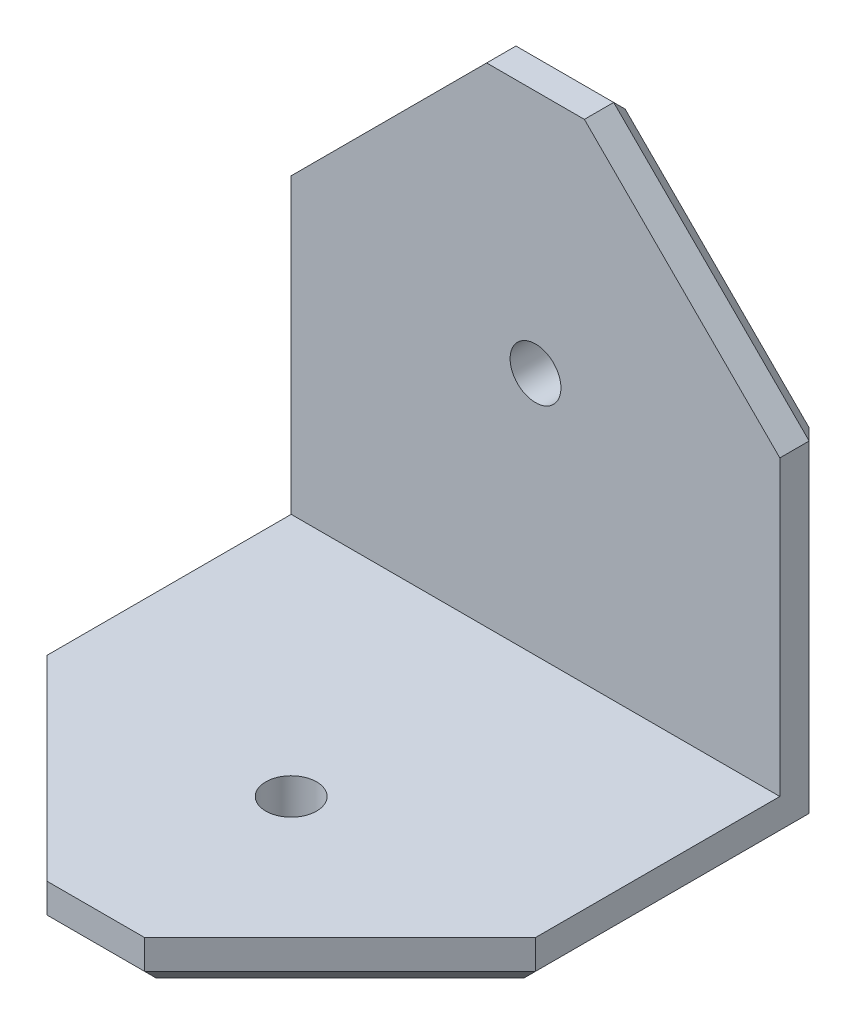
ISO-10303-21;
HEADER;
FILE_DESCRIPTION(('STEP AP214'),'2;1');
FILE_NAME('part.step','',(''),(''),'','','');
FILE_SCHEMA(('AUTOMOTIVE_DESIGN { 1 0 10303 214 1 1 1 1 }'));
ENDSEC;
DATA;
#1=APPLICATION_CONTEXT('core data for automotive mechanical design processes');
#2=APPLICATION_PROTOCOL_DEFINITION('international standard','automotive_design',2000,#1);
#3=PRODUCT_CONTEXT('',#1,'mechanical');
#4=PRODUCT('Part','Part','',(#3));
#5=PRODUCT_RELATED_PRODUCT_CATEGORY('part','',(#4));
#6=PRODUCT_DEFINITION_FORMATION('','',#4);
#7=PRODUCT_DEFINITION_CONTEXT('part definition',#1,'design');
#8=PRODUCT_DEFINITION('design','',#6,#7);
#9=PRODUCT_DEFINITION_SHAPE('','',#8);
#10=(LENGTH_UNIT() NAMED_UNIT(*) SI_UNIT(.MILLI.,.METRE.));
#11=(NAMED_UNIT(*) PLANE_ANGLE_UNIT() SI_UNIT($,.RADIAN.));
#12=(NAMED_UNIT(*) SI_UNIT($,.STERADIAN.) SOLID_ANGLE_UNIT());
#13=UNCERTAINTY_MEASURE_WITH_UNIT(LENGTH_MEASURE(1.E-05),#10,'distance_accuracy_value','');
#14=(GEOMETRIC_REPRESENTATION_CONTEXT(3) GLOBAL_UNCERTAINTY_ASSIGNED_CONTEXT((#13)) GLOBAL_UNIT_ASSIGNED_CONTEXT((#10,
#11,#12)) REPRESENTATION_CONTEXT('',''));
#15=CARTESIAN_POINT('',(0.,0.,0.));
#16=DIRECTION('',(0.,0.,1.));
#17=DIRECTION('',(1.,0.,0.));
#18=AXIS2_PLACEMENT_3D('',#15,#16,#17);
#19=CARTESIAN_POINT('',(25.,5.,-25.));
#20=DIRECTION('',(-1.,0.,0.));
#21=DIRECTION('',(0.,0.,1.));
#22=AXIS2_PLACEMENT_3D('',#19,#20,#21);
#23=PLANE('',#22);
#24=DIRECTION('',(0.,-1.,0.));
#25=VECTOR('',#24,1.);
#26=CARTESIAN_POINT('',(25.,5.,4.99999999999999));
#27=LINE('',#26,#25);
#28=CARTESIAN_POINT('',(25.,5.,4.99999999999999));
#29=VERTEX_POINT('',#28);
#30=CARTESIAN_POINT('',(25.,2.00000000000001,4.99999999999999));
#31=VERTEX_POINT('',#30);
#32=EDGE_CURVE('E211',#29,#31,#27,.T.);
#33=ORIENTED_EDGE('',*,*,#32,.T.);
#34=DIRECTION('',(0.,0.,-1.));
#35=VECTOR('',#34,1.);
#36=CARTESIAN_POINT('',(25.,2.00000000000002,-25.));
#37=LINE('',#36,#35);
#38=CARTESIAN_POINT('',(25.,2.00000000000002,-23.));
#39=VERTEX_POINT('',#38);
#40=EDGE_CURVE('E235',#31,#39,#37,.T.);
#41=ORIENTED_EDGE('',*,*,#40,.T.);
#42=DIRECTION('',(0.,1.,0.));
#43=VECTOR('',#42,1.);
#44=CARTESIAN_POINT('',(25.,5.,-23.));
#45=LINE('',#44,#43);
#46=CARTESIAN_POINT('',(25.,34.9999999999999,-23.));
#47=VERTEX_POINT('',#46);
#48=EDGE_CURVE('E233',#39,#47,#45,.T.);
#49=ORIENTED_EDGE('',*,*,#48,.T.);
#50=DIRECTION('',(0.,0.,1.));
#51=VECTOR('',#50,1.);
#52=CARTESIAN_POINT('',(25.,34.9999999999999,-25.));
#53=LINE('',#52,#51);
#54=CARTESIAN_POINT('',(25.,34.9999999999999,-20.));
#55=VERTEX_POINT('',#54);
#56=EDGE_CURVE('E180',#47,#55,#53,.T.);
#57=ORIENTED_EDGE('',*,*,#56,.T.);
#58=DIRECTION('',(0.,-1.,0.));
#59=VECTOR('',#58,1.);
#60=CARTESIAN_POINT('',(25.,55.,-20.));
#61=LINE('',#60,#59);
#62=CARTESIAN_POINT('',(25.,5.,-20.));
#63=VERTEX_POINT('',#62);
#64=EDGE_CURVE('E179',#55,#63,#61,.T.);
#65=ORIENTED_EDGE('',*,*,#64,.T.);
#66=DIRECTION('',(0.,0.,-1.));
#67=VECTOR('',#66,1.);
#68=CARTESIAN_POINT('',(25.,5.,-25.));
#69=LINE('',#68,#67);
#70=EDGE_CURVE('E162',#29,#63,#69,.T.);
#71=ORIENTED_EDGE('',*,*,#70,.F.);
#72=EDGE_LOOP('',(#33,#41,#49,#57,#65,#71));
#73=FACE_BOUND('',#72,.T.);
#74=ADVANCED_FACE('F40',(#73),#23,.F.);
#75=CARTESIAN_POINT('',(-25.,5.,-25.));
#76=DIRECTION('',(0.,0.,1.));
#77=DIRECTION('',(1.,0.,0.));
#78=AXIS2_PLACEMENT_3D('',#75,#76,#77);
#79=PLANE('',#78);
#80=CARTESIAN_POINT('',(0.,30.,-25.));
#81=DIRECTION('',(0.,0.,1.));
#82=DIRECTION('',(1.,0.,0.));
#83=AXIS2_PLACEMENT_3D('',#80,#81,#82);
#84=CIRCLE('',#83,2.6);
#85=CARTESIAN_POINT('',(2.6,30.,-25.));
#86=VERTEX_POINT('',#85);
#87=EDGE_CURVE('E187',#86,#86,#84,.T.);
#88=ORIENTED_EDGE('',*,*,#87,.T.);
#89=EDGE_LOOP('',(#88));
#90=FACE_BOUND('',#89,.T.);
#91=DIRECTION('',(0.707106781186546,-0.707106781186549,0.));
#92=VECTOR('',#91,1.);
#93=CARTESIAN_POINT('',(23.5857864376269,33.5857864376268,-25.));
#94=LINE('',#93,#92);
#95=CARTESIAN_POINT('',(4.17157287525378,53.,-25.));
#96=VERTEX_POINT('',#95);
#97=CARTESIAN_POINT('',(23.,34.1715728752537,-25.));
#98=VERTEX_POINT('',#97);
#99=EDGE_CURVE('E273',#96,#98,#94,.T.);
#100=ORIENTED_EDGE('',*,*,#99,.T.);
#101=DIRECTION('',(0.,-1.,0.));
#102=VECTOR('',#101,1.);
#103=CARTESIAN_POINT('',(23.,5.,-25.));
#104=LINE('',#103,#102);
#105=CARTESIAN_POINT('',(23.,2.00000000000002,-25.));
#106=VERTEX_POINT('',#105);
#107=EDGE_CURVE('E275',#98,#106,#104,.T.);
#108=ORIENTED_EDGE('',*,*,#107,.T.);
#109=DIRECTION('',(-1.,0.,0.));
#110=VECTOR('',#109,1.);
#111=CARTESIAN_POINT('',(-25.,2.00000000000002,-25.));
#112=LINE('',#111,#110);
#113=CARTESIAN_POINT('',(-23.,2.00000000000002,-25.));
#114=VERTEX_POINT('',#113);
#115=EDGE_CURVE('E227',#106,#114,#112,.T.);
#116=ORIENTED_EDGE('',*,*,#115,.T.);
#117=DIRECTION('',(0.,1.,0.));
#118=VECTOR('',#117,1.);
#119=CARTESIAN_POINT('',(-23.,5.,-25.));
#120=LINE('',#119,#118);
#121=CARTESIAN_POINT('',(-23.,34.1715728752537,-25.));
#122=VERTEX_POINT('',#121);
#123=EDGE_CURVE('E267',#114,#122,#120,.T.);
#124=ORIENTED_EDGE('',*,*,#123,.T.);
#125=DIRECTION('',(0.707106781186546,0.707106781186549,0.));
#126=VECTOR('',#125,1.);
#127=CARTESIAN_POINT('',(-3.58578643762688,53.5857864376269,-25.));
#128=LINE('',#127,#126);
#129=CARTESIAN_POINT('',(-4.17157287525379,53.,-25.));
#130=VERTEX_POINT('',#129);
#131=EDGE_CURVE('E269',#122,#130,#128,.T.);
#132=ORIENTED_EDGE('',*,*,#131,.T.);
#133=DIRECTION('',(1.,0.,0.));
#134=VECTOR('',#133,1.);
#135=CARTESIAN_POINT('',(-25.,53.,-25.));
#136=LINE('',#135,#134);
#137=EDGE_CURVE('E271',#130,#96,#136,.T.);
#138=ORIENTED_EDGE('',*,*,#137,.T.);
#139=EDGE_LOOP('',(#100,#108,#116,#124,#132,#138));
#140=FACE_BOUND('',#139,.T.);
#141=ADVANCED_FACE('F335',(#90,#140),#79,.F.);
#142=CARTESIAN_POINT('',(-25.,5.,-25.));
#143=DIRECTION('',(1.,0.,0.));
#144=DIRECTION('',(0.,0.,-1.));
#145=AXIS2_PLACEMENT_3D('',#142,#143,#144);
#146=PLANE('',#145);
#147=DIRECTION('',(0.,-1.,0.));
#148=VECTOR('',#147,1.);
#149=CARTESIAN_POINT('',(-25.,5.,-23.));
#150=LINE('',#149,#148);
#151=CARTESIAN_POINT('',(-25.,34.9999999999999,-23.));
#152=VERTEX_POINT('',#151);
#153=CARTESIAN_POINT('',(-25.,2.00000000000002,-23.));
#154=VERTEX_POINT('',#153);
#155=EDGE_CURVE('E263',#152,#154,#150,.T.);
#156=ORIENTED_EDGE('',*,*,#155,.T.);
#157=DIRECTION('',(0.,0.,1.));
#158=VECTOR('',#157,1.);
#159=CARTESIAN_POINT('',(-25.,2.00000000000002,-25.));
#160=LINE('',#159,#158);
#161=CARTESIAN_POINT('',(-25.,2.00000000000002,4.99999999999992));
#162=VERTEX_POINT('',#161);
#163=EDGE_CURVE('E265',#154,#162,#160,.T.);
#164=ORIENTED_EDGE('',*,*,#163,.T.);
#165=DIRECTION('',(0.,1.,0.));
#166=VECTOR('',#165,1.);
#167=CARTESIAN_POINT('',(-25.,5.,4.99999999999992));
#168=LINE('',#167,#166);
#169=CARTESIAN_POINT('',(-25.,5.,4.99999999999992));
#170=VERTEX_POINT('',#169);
#171=EDGE_CURVE('E225',#162,#170,#168,.T.);
#172=ORIENTED_EDGE('',*,*,#171,.T.);
#173=DIRECTION('',(0.,0.,1.));
#174=VECTOR('',#173,1.);
#175=CARTESIAN_POINT('',(-25.,5.,-25.));
#176=LINE('',#175,#174);
#177=CARTESIAN_POINT('',(-25.,5.,-20.));
#178=VERTEX_POINT('',#177);
#179=EDGE_CURVE('E175',#178,#170,#176,.T.);
#180=ORIENTED_EDGE('',*,*,#179,.F.);
#181=DIRECTION('',(0.,-1.,0.));
#182=VECTOR('',#181,1.);
#183=CARTESIAN_POINT('',(-25.,55.,-20.));
#184=LINE('',#183,#182);
#185=CARTESIAN_POINT('',(-25.,34.9999999999999,-20.));
#186=VERTEX_POINT('',#185);
#187=EDGE_CURVE('E176',#186,#178,#184,.T.);
#188=ORIENTED_EDGE('',*,*,#187,.F.);
#189=DIRECTION('',(0.,0.,-1.));
#190=VECTOR('',#189,1.);
#191=CARTESIAN_POINT('',(-25.,34.9999999999999,-25.));
#192=LINE('',#191,#190);
#193=EDGE_CURVE('E208',#186,#152,#192,.T.);
#194=ORIENTED_EDGE('',*,*,#193,.T.);
#195=EDGE_LOOP('',(#156,#164,#172,#180,#188,#194));
#196=FACE_BOUND('',#195,.T.);
#197=ADVANCED_FACE('F340',(#196),#146,.F.);
#198=CARTESIAN_POINT('',(-25.,5.,25.));
#199=DIRECTION('',(0.,0.,-1.));
#200=DIRECTION('',(-1.,0.,0.));
#201=AXIS2_PLACEMENT_3D('',#198,#199,#200);
#202=PLANE('',#201);
#203=DIRECTION('',(0.,-1.,0.));
#204=VECTOR('',#203,1.);
#205=CARTESIAN_POINT('',(-5.00000000000001,5.,25.));
#206=LINE('',#205,#204);
#207=CARTESIAN_POINT('',(-5.00000000000001,5.,25.));
#208=VERTEX_POINT('',#207);
#209=CARTESIAN_POINT('',(-5.00000000000001,2.00000000000002,25.));
#210=VERTEX_POINT('',#209);
#211=EDGE_CURVE('E217',#208,#210,#206,.T.);
#212=ORIENTED_EDGE('',*,*,#211,.T.);
#213=DIRECTION('',(1.,0.,0.));
#214=VECTOR('',#213,1.);
#215=CARTESIAN_POINT('',(-25.,2.00000000000002,25.));
#216=LINE('',#215,#214);
#217=CARTESIAN_POINT('',(4.99999999999992,2.00000000000002,25.));
#218=VERTEX_POINT('',#217);
#219=EDGE_CURVE('E259',#210,#218,#216,.T.);
#220=ORIENTED_EDGE('',*,*,#219,.T.);
#221=DIRECTION('',(0.,1.,0.));
#222=VECTOR('',#221,1.);
#223=CARTESIAN_POINT('',(4.99999999999992,5.,25.));
#224=LINE('',#223,#222);
#225=CARTESIAN_POINT('',(4.99999999999992,5.,25.));
#226=VERTEX_POINT('',#225);
#227=EDGE_CURVE('E220',#218,#226,#224,.T.);
#228=ORIENTED_EDGE('',*,*,#227,.T.);
#229=DIRECTION('',(1.,0.,0.));
#230=VECTOR('',#229,1.);
#231=CARTESIAN_POINT('',(-25.,5.,25.));
#232=LINE('',#231,#230);
#233=EDGE_CURVE('E197',#208,#226,#232,.T.);
#234=ORIENTED_EDGE('',*,*,#233,.F.);
#235=EDGE_LOOP('',(#212,#220,#228,#234));
#236=FACE_BOUND('',#235,.T.);
#237=ADVANCED_FACE('F469',(#236),#202,.F.);
#238=CARTESIAN_POINT('',(0.,5.,0.));
#239=DIRECTION('',(0.,1.,0.));
#240=DIRECTION('',(0.,0.,1.));
#241=AXIS2_PLACEMENT_3D('',#238,#239,#240);
#242=PLANE('',#241);
#243=CARTESIAN_POINT('',(0.,5.,5.));
#244=DIRECTION('',(0.,1.,0.));
#245=DIRECTION('',(0.,0.,1.));
#246=AXIS2_PLACEMENT_3D('',#243,#244,#245);
#247=CIRCLE('',#246,2.6);
#248=CARTESIAN_POINT('',(0.,5.,7.6));
#249=VERTEX_POINT('',#248);
#250=EDGE_CURVE('E215',#249,#249,#247,.T.);
#251=ORIENTED_EDGE('',*,*,#250,.F.);
#252=EDGE_LOOP('',(#251));
#253=FACE_BOUND('',#252,.T.);
#254=ORIENTED_EDGE('',*,*,#233,.T.);
#255=DIRECTION('',(-0.707106781186549,0.,0.707106781186546));
#256=VECTOR('',#255,1.);
#257=CARTESIAN_POINT('',(14.9999999999999,5.,15.));
#258=LINE('',#257,#256);
#259=EDGE_CURVE('E171',#226,#29,#258,.F.);
#260=ORIENTED_EDGE('',*,*,#259,.T.);
#261=ORIENTED_EDGE('',*,*,#70,.T.);
#262=DIRECTION('',(1.,0.,0.));
#263=VECTOR('',#262,1.);
#264=CARTESIAN_POINT('',(-25.,5.,-20.));
#265=LINE('',#264,#263);
#266=EDGE_CURVE('E168',#178,#63,#265,.T.);
#267=ORIENTED_EDGE('',*,*,#266,.F.);
#268=ORIENTED_EDGE('',*,*,#179,.T.);
#269=DIRECTION('',(-0.707106781186546,0.,-0.707106781186549));
#270=VECTOR('',#269,1.);
#271=CARTESIAN_POINT('',(-15.,5.,15.));
#272=LINE('',#271,#270);
#273=EDGE_CURVE('E222',#170,#208,#272,.F.);
#274=ORIENTED_EDGE('',*,*,#273,.T.);
#275=EDGE_LOOP('',(#254,#260,#261,#267,#268,#274));
#276=FACE_BOUND('',#275,.T.);
#277=ADVANCED_FACE('F165',(#253,#276),#242,.T.);
#278=CARTESIAN_POINT('',(0.,0.,0.));
#279=DIRECTION('',(0.,1.,0.));
#280=DIRECTION('',(0.,0.,1.));
#281=AXIS2_PLACEMENT_3D('',#278,#279,#280);
#282=PLANE('',#281);
#283=CARTESIAN_POINT('',(0.,0.,5.));
#284=DIRECTION('',(0.,1.,0.));
#285=DIRECTION('',(0.,0.,1.));
#286=AXIS2_PLACEMENT_3D('',#283,#284,#285);
#287=CIRCLE('',#286,2.6);
#288=CARTESIAN_POINT('',(0.,0.,7.6));
#289=VERTEX_POINT('',#288);
#290=EDGE_CURVE('E212',#289,#289,#287,.T.);
#291=ORIENTED_EDGE('',*,*,#290,.T.);
#292=EDGE_LOOP('',(#291));
#293=FACE_BOUND('',#292,.T.);
#294=DIRECTION('',(1.,0.,0.));
#295=VECTOR('',#294,1.);
#296=CARTESIAN_POINT('',(0.,0.,-23.));
#297=LINE('',#296,#295);
#298=CARTESIAN_POINT('',(-23.,0.,-23.));
#299=VERTEX_POINT('',#298);
#300=CARTESIAN_POINT('',(23.,0.,-23.));
#301=VERTEX_POINT('',#300);
#302=EDGE_CURVE('E230',#299,#301,#297,.T.);
#303=ORIENTED_EDGE('',*,*,#302,.T.);
#304=DIRECTION('',(0.,0.,1.));
#305=VECTOR('',#304,1.);
#306=CARTESIAN_POINT('',(23.,0.,0.));
#307=LINE('',#306,#305);
#308=CARTESIAN_POINT('',(23.,0.,4.17157287525379));
#309=VERTEX_POINT('',#308);
#310=EDGE_CURVE('E254',#301,#309,#307,.T.);
#311=ORIENTED_EDGE('',*,*,#310,.T.);
#312=DIRECTION('',(-0.707106781186549,0.,0.707106781186546));
#313=VECTOR('',#312,1.);
#314=CARTESIAN_POINT('',(3.58578643762681,0.,23.5857864376269));
#315=LINE('',#314,#313);
#316=CARTESIAN_POINT('',(4.17157287525372,0.,23.));
#317=VERTEX_POINT('',#316);
#318=EDGE_CURVE('E252',#309,#317,#315,.T.);
#319=ORIENTED_EDGE('',*,*,#318,.T.);
#320=DIRECTION('',(-1.,0.,0.));
#321=VECTOR('',#320,1.);
#322=CARTESIAN_POINT('',(0.,0.,23.));
#323=LINE('',#322,#321);
#324=CARTESIAN_POINT('',(-4.17157287525381,0.,23.));
#325=VERTEX_POINT('',#324);
#326=EDGE_CURVE('E250',#317,#325,#323,.T.);
#327=ORIENTED_EDGE('',*,*,#326,.T.);
#328=DIRECTION('',(-0.707106781186546,0.,-0.707106781186549));
#329=VECTOR('',#328,1.);
#330=CARTESIAN_POINT('',(-23.5857864376269,0.,3.58578643762682));
#331=LINE('',#330,#329);
#332=CARTESIAN_POINT('',(-23.,0.,4.17157287525373));
#333=VERTEX_POINT('',#332);
#334=EDGE_CURVE('E248',#325,#333,#331,.T.);
#335=ORIENTED_EDGE('',*,*,#334,.T.);
#336=DIRECTION('',(0.,0.,-1.));
#337=VECTOR('',#336,1.);
#338=CARTESIAN_POINT('',(-23.,0.,0.));
#339=LINE('',#338,#337);
#340=EDGE_CURVE('E246',#333,#299,#339,.T.);
#341=ORIENTED_EDGE('',*,*,#340,.T.);
#342=EDGE_LOOP('',(#303,#311,#319,#327,#335,#341));
#343=FACE_BOUND('',#342,.T.);
#344=ADVANCED_FACE('F324',(#293,#343),#282,.F.);
#345=CARTESIAN_POINT('',(-25.,55.,-20.));
#346=DIRECTION('',(0.,0.,-1.));
#347=DIRECTION('',(-1.,0.,0.));
#348=AXIS2_PLACEMENT_3D('',#345,#346,#347);
#349=PLANE('',#348);
#350=CARTESIAN_POINT('',(0.,30.,-20.));
#351=DIRECTION('',(0.,0.,1.));
#352=DIRECTION('',(1.,0.,0.));
#353=AXIS2_PLACEMENT_3D('',#350,#351,#352);
#354=CIRCLE('',#353,2.6);
#355=CARTESIAN_POINT('',(2.6,30.,-20.));
#356=VERTEX_POINT('',#355);
#357=EDGE_CURVE('E192',#356,#356,#354,.T.);
#358=ORIENTED_EDGE('',*,*,#357,.F.);
#359=EDGE_LOOP('',(#358));
#360=FACE_BOUND('',#359,.T.);
#361=ORIENTED_EDGE('',*,*,#64,.F.);
#362=DIRECTION('',(0.707106781186546,-0.707106781186549,0.));
#363=VECTOR('',#362,1.);
#364=CARTESIAN_POINT('',(4.99999999999999,55.,-20.));
#365=LINE('',#364,#363);
#366=CARTESIAN_POINT('',(4.99999999999998,55.,-20.));
#367=VERTEX_POINT('',#366);
#368=EDGE_CURVE('E206',#55,#367,#365,.F.);
#369=ORIENTED_EDGE('',*,*,#368,.T.);
#370=DIRECTION('',(1.,0.,0.));
#371=VECTOR('',#370,1.);
#372=CARTESIAN_POINT('',(-25.,55.,-20.));
#373=LINE('',#372,#371);
#374=CARTESIAN_POINT('',(-4.99999999999998,55.,-20.));
#375=VERTEX_POINT('',#374);
#376=EDGE_CURVE('E183',#375,#367,#373,.T.);
#377=ORIENTED_EDGE('',*,*,#376,.F.);
#378=DIRECTION('',(0.707106781186546,0.707106781186549,0.));
#379=VECTOR('',#378,1.);
#380=CARTESIAN_POINT('',(-4.99999999999998,55.,-20.));
#381=LINE('',#380,#379);
#382=EDGE_CURVE('E204',#375,#186,#381,.F.);
#383=ORIENTED_EDGE('',*,*,#382,.T.);
#384=ORIENTED_EDGE('',*,*,#187,.T.);
#385=ORIENTED_EDGE('',*,*,#266,.T.);
#386=EDGE_LOOP('',(#361,#369,#377,#383,#384,#385));
#387=FACE_BOUND('',#386,.T.);
#388=ADVANCED_FACE('F185',(#360,#387),#349,.F.);
#389=CARTESIAN_POINT('',(0.,55.,0.));
#390=DIRECTION('',(0.,-1.,0.));
#391=DIRECTION('',(0.,0.,-1.));
#392=AXIS2_PLACEMENT_3D('',#389,#390,#391);
#393=PLANE('',#392);
#394=DIRECTION('',(0.,0.,-1.));
#395=VECTOR('',#394,1.);
#396=CARTESIAN_POINT('',(4.99999999999999,55.,0.));
#397=LINE('',#396,#395);
#398=CARTESIAN_POINT('',(4.99999999999998,55.,-23.));
#399=VERTEX_POINT('',#398);
#400=EDGE_CURVE('E201',#367,#399,#397,.T.);
#401=ORIENTED_EDGE('',*,*,#400,.T.);
#402=DIRECTION('',(-1.,0.,0.));
#403=VECTOR('',#402,1.);
#404=CARTESIAN_POINT('',(0.,55.,-23.));
#405=LINE('',#404,#403);
#406=CARTESIAN_POINT('',(-4.99999999999998,55.,-23.));
#407=VERTEX_POINT('',#406);
#408=EDGE_CURVE('E50',#399,#407,#405,.T.);
#409=ORIENTED_EDGE('',*,*,#408,.T.);
#410=DIRECTION('',(0.,0.,1.));
#411=VECTOR('',#410,1.);
#412=CARTESIAN_POINT('',(-4.99999999999998,55.,0.));
#413=LINE('',#412,#411);
#414=EDGE_CURVE('E199',#407,#375,#413,.T.);
#415=ORIENTED_EDGE('',*,*,#414,.T.);
#416=ORIENTED_EDGE('',*,*,#376,.T.);
#417=EDGE_LOOP('',(#401,#409,#415,#416));
#418=FACE_BOUND('',#417,.T.);
#419=ADVANCED_FACE('F323',(#418),#393,.F.);
#420=CARTESIAN_POINT('',(0.,30.,-70.));
#421=DIRECTION('',(0.,0.,1.));
#422=DIRECTION('',(1.,0.,0.));
#423=AXIS2_PLACEMENT_3D('',#420,#421,#422);
#424=CYLINDRICAL_SURFACE('',#423,2.6);
#425=ORIENTED_EDGE('',*,*,#357,.T.);
#426=EDGE_LOOP('',(#425));
#427=FACE_BOUND('',#426,.T.);
#428=ORIENTED_EDGE('',*,*,#87,.F.);
#429=EDGE_LOOP('',(#428));
#430=FACE_BOUND('',#429,.T.);
#431=ADVANCED_FACE('F319',(#427,#430),#424,.F.);
#432=CARTESIAN_POINT('',(4.99999999999999,55.,0.));
#433=DIRECTION('',(-0.707106781186549,-0.707106781186546,0.));
#434=DIRECTION('',(0.,0.,-1.));
#435=AXIS2_PLACEMENT_3D('',#432,#433,#434);
#436=PLANE('',#435);
#437=ORIENTED_EDGE('',*,*,#56,.F.);
#438=DIRECTION('',(0.707106781186546,-0.707106781186549,0.));
#439=VECTOR('',#438,1.);
#440=CARTESIAN_POINT('',(4.99999999999998,55.,-23.));
#441=LINE('',#440,#439);
#442=EDGE_CURVE('E65',#47,#399,#441,.F.);
#443=ORIENTED_EDGE('',*,*,#442,.T.);
#444=ORIENTED_EDGE('',*,*,#400,.F.);
#445=ORIENTED_EDGE('',*,*,#368,.F.);
#446=EDGE_LOOP('',(#437,#443,#444,#445));
#447=FACE_BOUND('',#446,.T.);
#448=ADVANCED_FACE('F346',(#447),#436,.F.);
#449=CARTESIAN_POINT('',(-4.99999999999998,55.,0.));
#450=DIRECTION('',(0.707106781186549,-0.707106781186546,0.));
#451=DIRECTION('',(0.,0.,1.));
#452=AXIS2_PLACEMENT_3D('',#449,#450,#451);
#453=PLANE('',#452);
#454=ORIENTED_EDGE('',*,*,#414,.F.);
#455=DIRECTION('',(0.707106781186546,0.707106781186549,0.));
#456=VECTOR('',#455,1.);
#457=CARTESIAN_POINT('',(-25.,34.9999999999999,-23.));
#458=LINE('',#457,#456);
#459=EDGE_CURVE('E11',#407,#152,#458,.F.);
#460=ORIENTED_EDGE('',*,*,#459,.T.);
#461=ORIENTED_EDGE('',*,*,#193,.F.);
#462=ORIENTED_EDGE('',*,*,#382,.F.);
#463=EDGE_LOOP('',(#454,#460,#461,#462));
#464=FACE_BOUND('',#463,.T.);
#465=ADVANCED_FACE('F352',(#464),#453,.F.);
#466=CARTESIAN_POINT('',(0.,-45.,5.));
#467=DIRECTION('',(0.,1.,0.));
#468=DIRECTION('',(0.,0.,1.));
#469=AXIS2_PLACEMENT_3D('',#466,#467,#468);
#470=CYLINDRICAL_SURFACE('',#469,2.6);
#471=ORIENTED_EDGE('',*,*,#250,.T.);
#472=EDGE_LOOP('',(#471));
#473=FACE_BOUND('',#472,.T.);
#474=ORIENTED_EDGE('',*,*,#290,.F.);
#475=EDGE_LOOP('',(#474));
#476=FACE_BOUND('',#475,.T.);
#477=ADVANCED_FACE('F358',(#473,#476),#470,.F.);
#478=CARTESIAN_POINT('',(25.,5.,4.99999999999999));
#479=DIRECTION('',(-0.707106781186546,0.,-0.707106781186549));
#480=DIRECTION('',(0.,-1.,0.));
#481=AXIS2_PLACEMENT_3D('',#478,#479,#480);
#482=PLANE('',#481);
#483=ORIENTED_EDGE('',*,*,#227,.F.);
#484=DIRECTION('',(-0.707106781186549,0.,0.707106781186546));
#485=VECTOR('',#484,1.);
#486=CARTESIAN_POINT('',(25.,2.00000000000001,4.99999999999999));
#487=LINE('',#486,#485);
#488=EDGE_CURVE('E257',#218,#31,#487,.F.);
#489=ORIENTED_EDGE('',*,*,#488,.T.);
#490=ORIENTED_EDGE('',*,*,#32,.F.);
#491=ORIENTED_EDGE('',*,*,#259,.F.);
#492=EDGE_LOOP('',(#483,#489,#490,#491));
#493=FACE_BOUND('',#492,.T.);
#494=ADVANCED_FACE('F360',(#493),#482,.F.);
#495=CARTESIAN_POINT('',(-5.00000000000001,5.,25.));
#496=DIRECTION('',(0.707106781186549,0.,-0.707106781186546));
#497=DIRECTION('',(0.,-1.,0.));
#498=AXIS2_PLACEMENT_3D('',#495,#496,#497);
#499=PLANE('',#498);
#500=ORIENTED_EDGE('',*,*,#171,.F.);
#501=DIRECTION('',(-0.707106781186546,0.,-0.707106781186549));
#502=VECTOR('',#501,1.);
#503=CARTESIAN_POINT('',(-5.00000000000001,2.00000000000002,25.));
#504=LINE('',#503,#502);
#505=EDGE_CURVE('E261',#162,#210,#504,.F.);
#506=ORIENTED_EDGE('',*,*,#505,.T.);
#507=ORIENTED_EDGE('',*,*,#211,.F.);
#508=ORIENTED_EDGE('',*,*,#273,.F.);
#509=EDGE_LOOP('',(#500,#506,#507,#508));
#510=FACE_BOUND('',#509,.T.);
#511=ADVANCED_FACE('F366',(#510),#499,.F.);
#512=CARTESIAN_POINT('',(-25.,2.00000000000002,-25.));
#513=DIRECTION('',(0.,0.707106781186547,0.707106781186547));
#514=DIRECTION('',(-1.,0.,0.));
#515=AXIS2_PLACEMENT_3D('',#512,#513,#514);
#516=PLANE('',#515);
#517=DIRECTION('',(0.577350269189626,-0.577350269189626,0.577350269189626));
#518=VECTOR('',#517,1.);
#519=CARTESIAN_POINT('',(6.99999999999999,18.,-41.));
#520=LINE('',#519,#518);
#521=CARTESIAN_POINT('',(24.,1.00000000000002,-24.));
#522=VERTEX_POINT('',#521);
#523=EDGE_CURVE('E242',#106,#522,#520,.T.);
#524=ORIENTED_EDGE('',*,*,#523,.T.);
#525=DIRECTION('',(-0.577350269189626,-0.577350269189626,0.577350269189626));
#526=VECTOR('',#525,1.);
#527=CARTESIAN_POINT('',(8.33333333333332,-14.6666666666667,-8.33333333333334));
#528=LINE('',#527,#526);
#529=EDGE_CURVE('E244',#522,#301,#528,.T.);
#530=ORIENTED_EDGE('',*,*,#529,.T.);
#531=ORIENTED_EDGE('',*,*,#302,.F.);
#532=DIRECTION('',(-0.577350269189626,0.577350269189626,-0.577350269189626));
#533=VECTOR('',#532,1.);
#534=CARTESIAN_POINT('',(-25.,2.00000000000002,-25.));
#535=LINE('',#534,#533);
#536=CARTESIAN_POINT('',(-24.,1.00000000000001,-24.));
#537=VERTEX_POINT('',#536);
#538=EDGE_CURVE('E240',#299,#537,#535,.T.);
#539=ORIENTED_EDGE('',*,*,#538,.T.);
#540=DIRECTION('',(0.577350269189626,0.577350269189626,-0.577350269189626));
#541=VECTOR('',#540,1.);
#542=CARTESIAN_POINT('',(-23.6666666666667,1.33333333333335,-24.3333333333333));
#543=LINE('',#542,#541);
#544=EDGE_CURVE('E238',#537,#114,#543,.T.);
#545=ORIENTED_EDGE('',*,*,#544,.T.);
#546=ORIENTED_EDGE('',*,*,#115,.F.);
#547=EDGE_LOOP('',(#524,#530,#531,#539,#545,#546));
#548=FACE_BOUND('',#547,.T.);
#549=ADVANCED_FACE('F373',(#548),#516,.F.);
#550=CARTESIAN_POINT('',(-25.,5.,-23.));
#551=DIRECTION('',(0.707106781186547,0.,0.707106781186547));
#552=DIRECTION('',(0.,-1.,0.));
#553=AXIS2_PLACEMENT_3D('',#550,#551,#552);
#554=PLANE('',#553);
#555=ORIENTED_EDGE('',*,*,#123,.F.);
#556=ORIENTED_EDGE('',*,*,#544,.F.);
#557=DIRECTION('',(0.577350269189626,-0.577350269189626,-0.577350269189626));
#558=VECTOR('',#557,1.);
#559=CARTESIAN_POINT('',(-24.3333333333333,1.33333333333335,-23.6666666666667));
#560=LINE('',#559,#558);
#561=EDGE_CURVE('E45',#154,#537,#560,.T.);
#562=ORIENTED_EDGE('',*,*,#561,.F.);
#563=ORIENTED_EDGE('',*,*,#155,.F.);
#564=DIRECTION('',(0.678598344545847,-0.281084637714823,-0.678598344545847));
#565=VECTOR('',#564,1.);
#566=CARTESIAN_POINT('',(-19.2776929050836,32.6297427932217,-28.7223070949164));
#567=LINE('',#566,#565);
#568=EDGE_CURVE('E300',#122,#152,#567,.F.);
#569=ORIENTED_EDGE('',*,*,#568,.F.);
#570=EDGE_LOOP('',(#555,#556,#562,#563,#569));
#571=FACE_BOUND('',#570,.T.);
#572=ADVANCED_FACE('F43',(#571),#554,.F.);
#573=CARTESIAN_POINT('',(-25.,2.00000000000002,-25.));
#574=DIRECTION('',(0.707106781186547,0.707106781186547,0.));
#575=DIRECTION('',(0.,0.,1.));
#576=AXIS2_PLACEMENT_3D('',#573,#574,#575);
#577=PLANE('',#576);
#578=ORIENTED_EDGE('',*,*,#538,.F.);
#579=ORIENTED_EDGE('',*,*,#340,.F.);
#580=DIRECTION('',(-0.678598344545847,0.678598344545847,0.281084637714819));
#581=VECTOR('',#580,1.);
#582=CARTESIAN_POINT('',(-19.2776929050837,-3.72230709491633,2.6297427932218));
#583=LINE('',#582,#581);
#584=EDGE_CURVE('E298',#162,#333,#583,.F.);
#585=ORIENTED_EDGE('',*,*,#584,.F.);
#586=ORIENTED_EDGE('',*,*,#163,.F.);
#587=ORIENTED_EDGE('',*,*,#561,.T.);
#588=EDGE_LOOP('',(#578,#579,#585,#586,#587));
#589=FACE_BOUND('',#588,.T.);
#590=ADVANCED_FACE('F435',(#589),#577,.F.);
#591=CARTESIAN_POINT('',(-38.5857864376269,18.5857864376268,-25.));
#592=DIRECTION('',(0.5,-0.499999999999998,0.707106781186549));
#593=DIRECTION('',(0.707106781186546,0.707106781186549,0.));
#594=AXIS2_PLACEMENT_3D('',#591,#592,#593);
#595=PLANE('',#594);
#596=ORIENTED_EDGE('',*,*,#568,.T.);
#597=ORIENTED_EDGE('',*,*,#459,.F.);
#598=DIRECTION('',(0.281084637714824,-0.678598344545846,-0.678598344545846));
#599=VECTOR('',#598,1.);
#600=CARTESIAN_POINT('',(-0.32630085118316,43.716692128475,-34.283307871525));
#601=LINE('',#600,#599);
#602=EDGE_CURVE('E295',#130,#407,#601,.F.);
#603=ORIENTED_EDGE('',*,*,#602,.F.);
#604=ORIENTED_EDGE('',*,*,#131,.F.);
#605=EDGE_LOOP('',(#596,#597,#603,#604));
#606=FACE_BOUND('',#605,.T.);
#607=ADVANCED_FACE('F429',(#606),#595,.F.);
#608=CARTESIAN_POINT('',(-13.5857864376269,0.,13.5857864376269));
#609=DIRECTION('',(0.500000000000001,0.707106781186547,-0.499999999999999));
#610=DIRECTION('',(-0.707106781186546,0.,-0.707106781186549));
#611=AXIS2_PLACEMENT_3D('',#608,#609,#610);
#612=PLANE('',#611);
#613=ORIENTED_EDGE('',*,*,#584,.T.);
#614=ORIENTED_EDGE('',*,*,#334,.F.);
#615=DIRECTION('',(-0.28108463771482,0.678598344545847,0.678598344545847));
#616=VECTOR('',#615,1.);
#617=CARTESIAN_POINT('',(-3.11967575796507,-2.53950428677965,20.4604957132203));
#618=LINE('',#617,#616);
#619=EDGE_CURVE('E292',#210,#325,#618,.F.);
#620=ORIENTED_EDGE('',*,*,#619,.F.);
#621=ORIENTED_EDGE('',*,*,#505,.F.);
#622=EDGE_LOOP('',(#613,#614,#620,#621));
#623=FACE_BOUND('',#622,.T.);
#624=ADVANCED_FACE('F422',(#623),#612,.F.);
#625=CARTESIAN_POINT('',(0.,55.,-23.));
#626=DIRECTION('',(0.,-0.707106781186547,0.707106781186547));
#627=DIRECTION('',(-1.,0.,0.));
#628=AXIS2_PLACEMENT_3D('',#625,#626,#627);
#629=PLANE('',#628);
#630=ORIENTED_EDGE('',*,*,#602,.T.);
#631=ORIENTED_EDGE('',*,*,#408,.F.);
#632=DIRECTION('',(-0.281084637714824,-0.678598344545846,-0.678598344545846));
#633=VECTOR('',#632,1.);
#634=CARTESIAN_POINT('',(4.60495713220362,54.0462821508473,-23.9537178491527));
#635=LINE('',#634,#633);
#636=EDGE_CURVE('E289',#96,#399,#635,.F.);
#637=ORIENTED_EDGE('',*,*,#636,.F.);
#638=ORIENTED_EDGE('',*,*,#137,.F.);
#639=EDGE_LOOP('',(#630,#631,#637,#638));
#640=FACE_BOUND('',#639,.T.);
#641=ADVANCED_FACE('F415',(#640),#629,.F.);
#642=CARTESIAN_POINT('',(-25.,2.00000000000002,25.));
#643=DIRECTION('',(0.,0.707106781186547,-0.707106781186547));
#644=DIRECTION('',(1.,0.,0.));
#645=AXIS2_PLACEMENT_3D('',#642,#643,#644);
#646=PLANE('',#645);
#647=ORIENTED_EDGE('',*,*,#619,.T.);
#648=ORIENTED_EDGE('',*,*,#326,.F.);
#649=DIRECTION('',(0.28108463771482,0.678598344545847,0.678598344545847));
#650=VECTOR('',#649,1.);
#651=CARTESIAN_POINT('',(2.62974279322177,-3.72230709491636,19.2776929050836));
#652=LINE('',#651,#650);
#653=EDGE_CURVE('E286',#218,#317,#652,.F.);
#654=ORIENTED_EDGE('',*,*,#653,.F.);
#655=ORIENTED_EDGE('',*,*,#219,.F.);
#656=EDGE_LOOP('',(#647,#648,#654,#655));
#657=FACE_BOUND('',#656,.T.);
#658=ADVANCED_FACE('F408',(#657),#646,.F.);
#659=CARTESIAN_POINT('',(13.5857864376269,43.5857864376268,-25.));
#660=DIRECTION('',(-0.5,-0.499999999999998,0.707106781186549));
#661=DIRECTION('',(0.707106781186546,-0.707106781186549,0.));
#662=AXIS2_PLACEMENT_3D('',#659,#660,#661);
#663=PLANE('',#662);
#664=ORIENTED_EDGE('',*,*,#636,.T.);
#665=ORIENTED_EDGE('',*,*,#442,.F.);
#666=DIRECTION('',(-0.678598344545846,-0.281084637714823,-0.678598344545846));
#667=VECTOR('',#666,1.);
#668=CARTESIAN_POINT('',(20.4604957132204,33.119675757965,-27.5395042867796));
#669=LINE('',#668,#667);
#670=EDGE_CURVE('E283',#98,#47,#669,.F.);
#671=ORIENTED_EDGE('',*,*,#670,.F.);
#672=ORIENTED_EDGE('',*,*,#99,.F.);
#673=EDGE_LOOP('',(#664,#665,#671,#672));
#674=FACE_BOUND('',#673,.T.);
#675=ADVANCED_FACE('F401',(#674),#663,.F.);
#676=CARTESIAN_POINT('',(13.5857864376268,0.,13.5857864376269));
#677=DIRECTION('',(-0.499999999999999,0.707106781186548,-0.500000000000001));
#678=DIRECTION('',(-0.707106781186549,0.,0.707106781186546));
#679=AXIS2_PLACEMENT_3D('',#676,#677,#678);
#680=PLANE('',#679);
#681=ORIENTED_EDGE('',*,*,#653,.T.);
#682=ORIENTED_EDGE('',*,*,#318,.F.);
#683=DIRECTION('',(0.678598344545847,0.678598344545847,0.281084637714822));
#684=VECTOR('',#683,1.);
#685=CARTESIAN_POINT('',(20.4604957132203,-2.53950428677964,3.11967575796505));
#686=LINE('',#685,#684);
#687=EDGE_CURVE('E281',#31,#309,#686,.F.);
#688=ORIENTED_EDGE('',*,*,#687,.F.);
#689=ORIENTED_EDGE('',*,*,#488,.F.);
#690=EDGE_LOOP('',(#681,#682,#688,#689));
#691=FACE_BOUND('',#690,.T.);
#692=ADVANCED_FACE('F394',(#691),#680,.F.);
#693=CARTESIAN_POINT('',(23.,5.,-25.));
#694=DIRECTION('',(-0.707106781186547,0.,0.707106781186547));
#695=DIRECTION('',(0.,-1.,0.));
#696=AXIS2_PLACEMENT_3D('',#693,#694,#695);
#697=PLANE('',#696);
#698=ORIENTED_EDGE('',*,*,#670,.T.);
#699=ORIENTED_EDGE('',*,*,#48,.F.);
#700=DIRECTION('',(-0.577350269189626,-0.577350269189626,-0.577350269189626));
#701=VECTOR('',#700,1.);
#702=CARTESIAN_POINT('',(24.6666666666667,1.66666666666668,-23.3333333333333));
#703=LINE('',#702,#701);
#704=EDGE_CURVE('E279',#522,#39,#703,.F.);
#705=ORIENTED_EDGE('',*,*,#704,.F.);
#706=ORIENTED_EDGE('',*,*,#523,.F.);
#707=ORIENTED_EDGE('',*,*,#107,.F.);
#708=EDGE_LOOP('',(#698,#699,#705,#706,#707));
#709=FACE_BOUND('',#708,.T.);
#710=ADVANCED_FACE('F387',(#709),#697,.F.);
#711=CARTESIAN_POINT('',(25.,2.00000000000002,-25.));
#712=DIRECTION('',(-0.707106781186547,0.707106781186547,0.));
#713=DIRECTION('',(0.,0.,-1.));
#714=AXIS2_PLACEMENT_3D('',#711,#712,#713);
#715=PLANE('',#714);
#716=ORIENTED_EDGE('',*,*,#687,.T.);
#717=ORIENTED_EDGE('',*,*,#310,.F.);
#718=ORIENTED_EDGE('',*,*,#529,.F.);
#719=ORIENTED_EDGE('',*,*,#704,.T.);
#720=ORIENTED_EDGE('',*,*,#40,.F.);
#721=EDGE_LOOP('',(#716,#717,#718,#719,#720));
#722=FACE_BOUND('',#721,.T.);
#723=ADVANCED_FACE('F381',(#722),#715,.F.);
#724=CLOSED_SHELL('',(#74,#141,#197,#237,#277,#344,#388,#419,#431,#448,#465,#477,#494,#511,#549,
#572,#590,#607,#624,#641,#658,#675,#692,#710,#723));
#725=MANIFOLD_SOLID_BREP('B2',#724);
#726=ADVANCED_BREP_SHAPE_REPRESENTATION('',(#18,#725),#14);
#727=SHAPE_DEFINITION_REPRESENTATION(#9,#726);
ENDSEC;
END-ISO-10303-21;
